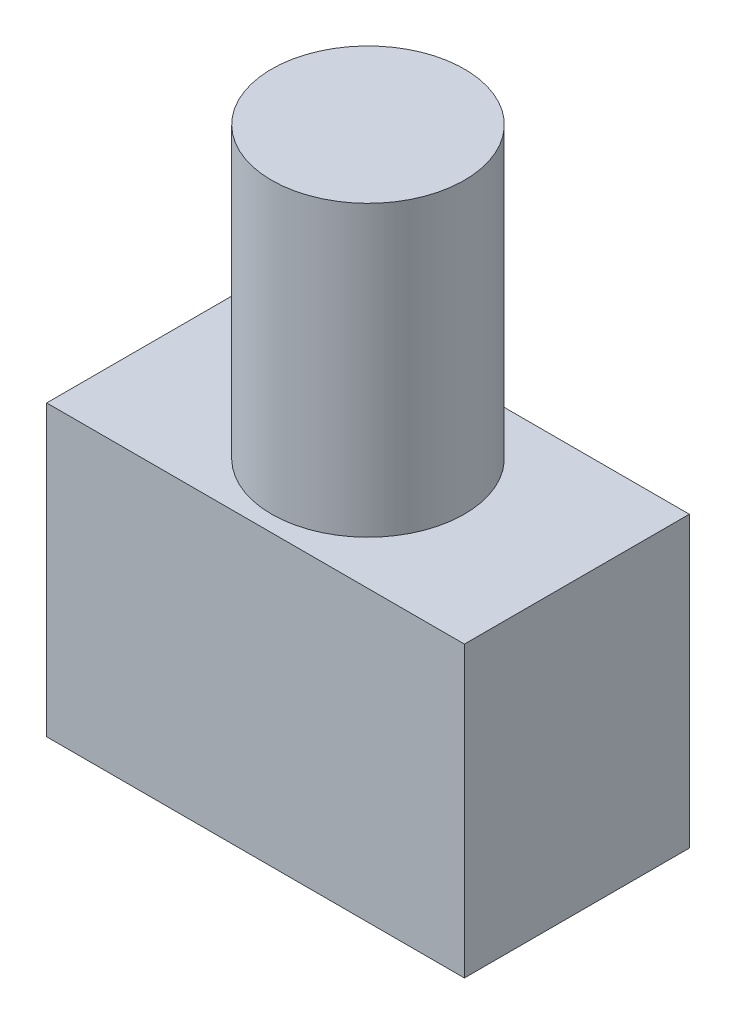
ISO-10303-21;
HEADER;
FILE_DESCRIPTION(('STEP AP214'),'2;1');
FILE_NAME('part.step','',(''),(''),'','','');
FILE_SCHEMA(('AUTOMOTIVE_DESIGN { 1 0 10303 214 1 1 1 1 }'));
ENDSEC;
DATA;
#1=APPLICATION_CONTEXT('core data for automotive mechanical design processes');
#2=APPLICATION_PROTOCOL_DEFINITION('international standard','automotive_design',2000,#1);
#3=PRODUCT_CONTEXT('',#1,'mechanical');
#4=PRODUCT('Part','Part','',(#3));
#5=PRODUCT_RELATED_PRODUCT_CATEGORY('part','',(#4));
#6=PRODUCT_DEFINITION_FORMATION('','',#4);
#7=PRODUCT_DEFINITION_CONTEXT('part definition',#1,'design');
#8=PRODUCT_DEFINITION('design','',#6,#7);
#9=PRODUCT_DEFINITION_SHAPE('','',#8);
#10=(LENGTH_UNIT() NAMED_UNIT(*) SI_UNIT(.MILLI.,.METRE.));
#11=(NAMED_UNIT(*) PLANE_ANGLE_UNIT() SI_UNIT($,.RADIAN.));
#12=(NAMED_UNIT(*) SI_UNIT($,.STERADIAN.) SOLID_ANGLE_UNIT());
#13=UNCERTAINTY_MEASURE_WITH_UNIT(LENGTH_MEASURE(1.E-05),#10,'distance_accuracy_value','');
#14=(GEOMETRIC_REPRESENTATION_CONTEXT(3) GLOBAL_UNCERTAINTY_ASSIGNED_CONTEXT((#13)) GLOBAL_UNIT_ASSIGNED_CONTEXT((#10,
#11,#12)) REPRESENTATION_CONTEXT('',''));
#15=CARTESIAN_POINT('',(0.,0.,0.));
#16=DIRECTION('',(0.,0.,1.));
#17=DIRECTION('',(1.,0.,0.));
#18=AXIS2_PLACEMENT_3D('',#15,#16,#17);
#19=CARTESIAN_POINT('',(6.5,9.,-3.5));
#20=DIRECTION('',(-1.,0.,0.));
#21=DIRECTION('',(0.,0.,1.));
#22=AXIS2_PLACEMENT_3D('',#19,#20,#21);
#23=PLANE('',#22);
#24=DIRECTION('',(0.,0.,-1.));
#25=VECTOR('',#24,1.);
#26=CARTESIAN_POINT('',(6.5,0.,-3.5));
#27=LINE('',#26,#25);
#28=CARTESIAN_POINT('',(6.5,0.,3.5));
#29=VERTEX_POINT('',#28);
#30=CARTESIAN_POINT('',(6.5,0.,-3.5));
#31=VERTEX_POINT('',#30);
#32=EDGE_CURVE('E95',#29,#31,#27,.T.);
#33=ORIENTED_EDGE('',*,*,#32,.T.);
#34=DIRECTION('',(0.,-1.,0.));
#35=VECTOR('',#34,1.);
#36=CARTESIAN_POINT('',(6.5,9.,-3.5));
#37=LINE('',#36,#35);
#38=CARTESIAN_POINT('',(6.5,9.,-3.5));
#39=VERTEX_POINT('',#38);
#40=EDGE_CURVE('E11',#39,#31,#37,.T.);
#41=ORIENTED_EDGE('',*,*,#40,.F.);
#42=DIRECTION('',(0.,0.,-1.));
#43=VECTOR('',#42,1.);
#44=CARTESIAN_POINT('',(6.5,9.,-3.5));
#45=LINE('',#44,#43);
#46=CARTESIAN_POINT('',(6.5,9.,3.5));
#47=VERTEX_POINT('',#46);
#48=EDGE_CURVE('E83',#47,#39,#45,.T.);
#49=ORIENTED_EDGE('',*,*,#48,.F.);
#50=DIRECTION('',(0.,-1.,0.));
#51=VECTOR('',#50,1.);
#52=CARTESIAN_POINT('',(6.5,9.,3.5));
#53=LINE('',#52,#51);
#54=EDGE_CURVE('E91',#47,#29,#53,.T.);
#55=ORIENTED_EDGE('',*,*,#54,.T.);
#56=EDGE_LOOP('',(#33,#41,#49,#55));
#57=FACE_BOUND('',#56,.T.);
#58=ADVANCED_FACE('F32',(#57),#23,.F.);
#59=CARTESIAN_POINT('',(-6.5,9.,-3.5));
#60=DIRECTION('',(0.,0.,1.));
#61=DIRECTION('',(1.,0.,0.));
#62=AXIS2_PLACEMENT_3D('',#59,#60,#61);
#63=PLANE('',#62);
#64=DIRECTION('',(-1.,0.,0.));
#65=VECTOR('',#64,1.);
#66=CARTESIAN_POINT('',(-6.5,0.,-3.5));
#67=LINE('',#66,#65);
#68=CARTESIAN_POINT('',(-6.5,0.,-3.5));
#69=VERTEX_POINT('',#68);
#70=EDGE_CURVE('E87',#31,#69,#67,.T.);
#71=ORIENTED_EDGE('',*,*,#70,.T.);
#72=DIRECTION('',(0.,-1.,0.));
#73=VECTOR('',#72,1.);
#74=CARTESIAN_POINT('',(-6.5,9.,-3.5));
#75=LINE('',#74,#73);
#76=CARTESIAN_POINT('',(-6.5,9.,-3.5));
#77=VERTEX_POINT('',#76);
#78=EDGE_CURVE('E40',#77,#69,#75,.T.);
#79=ORIENTED_EDGE('',*,*,#78,.F.);
#80=DIRECTION('',(-1.,0.,0.));
#81=VECTOR('',#80,1.);
#82=CARTESIAN_POINT('',(-6.5,9.,-3.5));
#83=LINE('',#82,#81);
#84=EDGE_CURVE('E78',#39,#77,#83,.T.);
#85=ORIENTED_EDGE('',*,*,#84,.F.);
#86=ORIENTED_EDGE('',*,*,#40,.T.);
#87=EDGE_LOOP('',(#71,#79,#85,#86));
#88=FACE_BOUND('',#87,.T.);
#89=ADVANCED_FACE('F86',(#88),#63,.F.);
#90=CARTESIAN_POINT('',(-6.5,9.,-3.5));
#91=DIRECTION('',(1.,0.,0.));
#92=DIRECTION('',(0.,0.,-1.));
#93=AXIS2_PLACEMENT_3D('',#90,#91,#92);
#94=PLANE('',#93);
#95=DIRECTION('',(0.,0.,1.));
#96=VECTOR('',#95,1.);
#97=CARTESIAN_POINT('',(-6.5,0.,-3.5));
#98=LINE('',#97,#96);
#99=CARTESIAN_POINT('',(-6.5,0.,3.5));
#100=VERTEX_POINT('',#99);
#101=EDGE_CURVE('E65',#69,#100,#98,.T.);
#102=ORIENTED_EDGE('',*,*,#101,.T.);
#103=DIRECTION('',(0.,-1.,0.));
#104=VECTOR('',#103,1.);
#105=CARTESIAN_POINT('',(-6.5,9.,3.5));
#106=LINE('',#105,#104);
#107=CARTESIAN_POINT('',(-6.5,9.,3.5));
#108=VERTEX_POINT('',#107);
#109=EDGE_CURVE('E88',#108,#100,#106,.T.);
#110=ORIENTED_EDGE('',*,*,#109,.F.);
#111=DIRECTION('',(0.,0.,1.));
#112=VECTOR('',#111,1.);
#113=CARTESIAN_POINT('',(-6.5,9.,-3.5));
#114=LINE('',#113,#112);
#115=EDGE_CURVE('E81',#77,#108,#114,.T.);
#116=ORIENTED_EDGE('',*,*,#115,.F.);
#117=ORIENTED_EDGE('',*,*,#78,.T.);
#118=EDGE_LOOP('',(#102,#110,#116,#117));
#119=FACE_BOUND('',#118,.T.);
#120=ADVANCED_FACE('F89',(#119),#94,.F.);
#121=CARTESIAN_POINT('',(-6.5,9.,3.5));
#122=DIRECTION('',(0.,0.,-1.));
#123=DIRECTION('',(-1.,0.,0.));
#124=AXIS2_PLACEMENT_3D('',#121,#122,#123);
#125=PLANE('',#124);
#126=DIRECTION('',(1.,0.,0.));
#127=VECTOR('',#126,1.);
#128=CARTESIAN_POINT('',(-6.5,0.,3.5));
#129=LINE('',#128,#127);
#130=EDGE_CURVE('E71',#100,#29,#129,.T.);
#131=ORIENTED_EDGE('',*,*,#130,.T.);
#132=ORIENTED_EDGE('',*,*,#54,.F.);
#133=DIRECTION('',(1.,0.,0.));
#134=VECTOR('',#133,1.);
#135=CARTESIAN_POINT('',(-6.5,9.,3.5));
#136=LINE('',#135,#134);
#137=EDGE_CURVE('E48',#108,#47,#136,.T.);
#138=ORIENTED_EDGE('',*,*,#137,.F.);
#139=ORIENTED_EDGE('',*,*,#109,.T.);
#140=EDGE_LOOP('',(#131,#132,#138,#139));
#141=FACE_BOUND('',#140,.T.);
#142=ADVANCED_FACE('F103',(#141),#125,.F.);
#143=CARTESIAN_POINT('',(0.,9.,0.));
#144=DIRECTION('',(0.,1.,0.));
#145=DIRECTION('',(0.,0.,1.));
#146=AXIS2_PLACEMENT_3D('',#143,#144,#145);
#147=PLANE('',#146);
#148=CARTESIAN_POINT('',(0.,9.,0.));
#149=DIRECTION('',(0.,1.,0.));
#150=DIRECTION('',(0.,0.,1.));
#151=AXIS2_PLACEMENT_3D('',#148,#149,#150);
#152=CIRCLE('',#151,3.);
#153=CARTESIAN_POINT('',(0.,9.,3.));
#154=VERTEX_POINT('',#153);
#155=EDGE_CURVE('E109',#154,#154,#152,.T.);
#156=ORIENTED_EDGE('',*,*,#155,.F.);
#157=EDGE_LOOP('',(#156));
#158=FACE_BOUND('',#157,.T.);
#159=ORIENTED_EDGE('',*,*,#48,.T.);
#160=ORIENTED_EDGE('',*,*,#84,.T.);
#161=ORIENTED_EDGE('',*,*,#115,.T.);
#162=ORIENTED_EDGE('',*,*,#137,.T.);
#163=EDGE_LOOP('',(#159,#160,#161,#162));
#164=FACE_BOUND('',#163,.T.);
#165=ADVANCED_FACE('F79',(#158,#164),#147,.T.);
#166=CARTESIAN_POINT('',(0.,0.,0.));
#167=DIRECTION('',(0.,1.,0.));
#168=DIRECTION('',(0.,0.,1.));
#169=AXIS2_PLACEMENT_3D('',#166,#167,#168);
#170=PLANE('',#169);
#171=ORIENTED_EDGE('',*,*,#32,.F.);
#172=ORIENTED_EDGE('',*,*,#130,.F.);
#173=ORIENTED_EDGE('',*,*,#101,.F.);
#174=ORIENTED_EDGE('',*,*,#70,.F.);
#175=EDGE_LOOP('',(#171,#172,#173,#174));
#176=FACE_BOUND('',#175,.T.);
#177=ADVANCED_FACE('F106',(#176),#170,.F.);
#178=CARTESIAN_POINT('',(0.,18.,0.));
#179=DIRECTION('',(0.,-1.,0.));
#180=DIRECTION('',(0.,0.,-1.));
#181=AXIS2_PLACEMENT_3D('',#178,#179,#180);
#182=CYLINDRICAL_SURFACE('',#181,3.);
#183=CARTESIAN_POINT('',(0.,18.,0.));
#184=DIRECTION('',(0.,1.,0.));
#185=DIRECTION('',(0.,0.,1.));
#186=AXIS2_PLACEMENT_3D('',#183,#184,#185);
#187=CIRCLE('',#186,3.);
#188=CARTESIAN_POINT('',(0.,18.,3.));
#189=VERTEX_POINT('',#188);
#190=EDGE_CURVE('E98',#189,#189,#187,.T.);
#191=ORIENTED_EDGE('',*,*,#190,.F.);
#192=EDGE_LOOP('',(#191));
#193=FACE_BOUND('',#192,.T.);
#194=ORIENTED_EDGE('',*,*,#155,.T.);
#195=EDGE_LOOP('',(#194));
#196=FACE_BOUND('',#195,.T.);
#197=ADVANCED_FACE('F117',(#193,#196),#182,.T.);
#198=CARTESIAN_POINT('',(0.,18.,0.));
#199=DIRECTION('',(0.,1.,0.));
#200=DIRECTION('',(0.,0.,1.));
#201=AXIS2_PLACEMENT_3D('',#198,#199,#200);
#202=PLANE('',#201);
#203=ORIENTED_EDGE('',*,*,#190,.T.);
#204=EDGE_LOOP('',(#203));
#205=FACE_BOUND('',#204,.T.);
#206=ADVANCED_FACE('F115',(#205),#202,.T.);
#207=CLOSED_SHELL('',(#58,#89,#120,#142,#165,#177,#197,#206));
#208=MANIFOLD_SOLID_BREP('B2',#207);
#209=ADVANCED_BREP_SHAPE_REPRESENTATION('',(#18,#208),#14);
#210=SHAPE_DEFINITION_REPRESENTATION(#9,#209);
ENDSEC;
END-ISO-10303-21;
